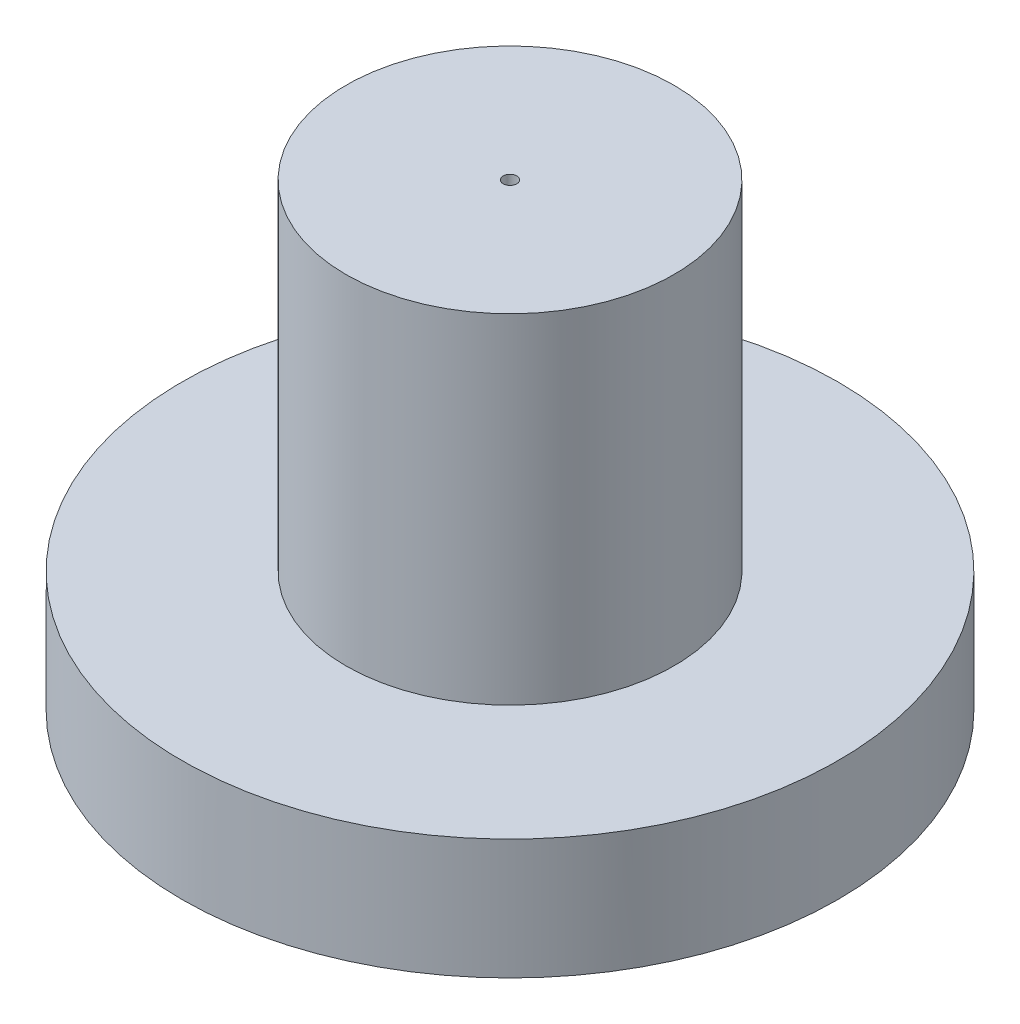
ISO-10303-21;
HEADER;
FILE_DESCRIPTION(('STEP AP214'),'2;1');
FILE_NAME('part.step','',(''),(''),'','','');
FILE_SCHEMA(('AUTOMOTIVE_DESIGN { 1 0 10303 214 1 1 1 1 }'));
ENDSEC;
DATA;
#1=APPLICATION_CONTEXT('core data for automotive mechanical design processes');
#2=APPLICATION_PROTOCOL_DEFINITION('international standard','automotive_design',2000,#1);
#3=PRODUCT_CONTEXT('',#1,'mechanical');
#4=PRODUCT('Part','Part','',(#3));
#5=PRODUCT_RELATED_PRODUCT_CATEGORY('part','',(#4));
#6=PRODUCT_DEFINITION_FORMATION('','',#4);
#7=PRODUCT_DEFINITION_CONTEXT('part definition',#1,'design');
#8=PRODUCT_DEFINITION('design','',#6,#7);
#9=PRODUCT_DEFINITION_SHAPE('','',#8);
#10=(LENGTH_UNIT() NAMED_UNIT(*) SI_UNIT(.MILLI.,.METRE.));
#11=(NAMED_UNIT(*) PLANE_ANGLE_UNIT() SI_UNIT($,.RADIAN.));
#12=(NAMED_UNIT(*) SI_UNIT($,.STERADIAN.) SOLID_ANGLE_UNIT());
#13=UNCERTAINTY_MEASURE_WITH_UNIT(LENGTH_MEASURE(1.E-05),#10,'distance_accuracy_value','');
#14=(GEOMETRIC_REPRESENTATION_CONTEXT(3) GLOBAL_UNCERTAINTY_ASSIGNED_CONTEXT((#13)) GLOBAL_UNIT_ASSIGNED_CONTEXT((#10,
#11,#12)) REPRESENTATION_CONTEXT('',''));
#15=CARTESIAN_POINT('',(0.,0.,0.));
#16=DIRECTION('',(0.,0.,1.));
#17=DIRECTION('',(1.,0.,0.));
#18=AXIS2_PLACEMENT_3D('',#15,#16,#17);
#19=CARTESIAN_POINT('',(0.,16.6728719726352,0.));
#20=DIRECTION('',(0.,1.,0.));
#21=DIRECTION('',(-1.,0.,0.));
#22=AXIS2_PLACEMENT_3D('',#19,#20,#21);
#23=SPHERICAL_SURFACE('',#22,20.8080401316239);
#24=CARTESIAN_POINT('',(0.,-1.68290461456677,0.));
#25=DIRECTION('',(0.,1.,0.));
#26=DIRECTION('',(0.,0.,1.));
#27=AXIS2_PLACEMENT_3D('',#24,#25,#26);
#28=CIRCLE('',#27,9.8);
#29=CARTESIAN_POINT('',(0.,-1.68290461456677,9.8));
#30=VERTEX_POINT('',#29);
#31=EDGE_CURVE('E11',#30,#30,#28,.T.);
#32=ORIENTED_EDGE('',*,*,#31,.F.);
#33=EDGE_LOOP('',(#32));
#34=FACE_BOUND('',#33,.T.);
#35=ADVANCED_FACE('F45',(#34),#23,.T.);
#36=CARTESIAN_POINT('',(0.,-29.3754521456294,0.));
#37=DIRECTION('',(0.,1.,0.));
#38=DIRECTION('',(1.,0.,0.));
#39=AXIS2_PLACEMENT_3D('',#36,#37,#38);
#40=SPHERICAL_SURFACE('',#39,29.3754521456294);
#41=ORIENTED_EDGE('',*,*,#31,.T.);
#42=EDGE_LOOP('',(#41));
#43=FACE_BOUND('',#42,.T.);
#44=ADVANCED_FACE('F52',(#43),#40,.T.);
#45=CLOSED_SHELL('',(#35,#44));
#46=MANIFOLD_SOLID_BREP('B2',#45);
#47=CARTESIAN_POINT('',(0.,4.56242759464748,0.));
#48=DIRECTION('',(0.,-1.,0.));
#49=DIRECTION('',(1.,0.,0.));
#50=AXIS2_PLACEMENT_3D('',#47,#48,#49);
#51=SPHERICAL_SURFACE('',#50,6.27592735682813);
#52=CARTESIAN_POINT('',(0.,-0.273610472632774,0.));
#53=DIRECTION('',(0.,-1.,0.));
#54=DIRECTION('',(0.,0.,-1.));
#55=AXIS2_PLACEMENT_3D('',#52,#53,#54);
#56=CIRCLE('',#55,3.99999999999998);
#57=CARTESIAN_POINT('',(0.,-0.273610472632774,-3.99999999999998));
#58=VERTEX_POINT('',#57);
#59=EDGE_CURVE('E44',#58,#58,#56,.T.);
#60=ORIENTED_EDGE('',*,*,#59,.T.);
#61=EDGE_LOOP('',(#60));
#62=FACE_BOUND('',#61,.T.);
#63=ADVANCED_FACE('F78',(#62),#51,.T.);
#64=CARTESIAN_POINT('',(0.,-29.3754521456294,0.));
#65=DIRECTION('',(0.,-1.,0.));
#66=DIRECTION('',(1.,0.,0.));
#67=AXIS2_PLACEMENT_3D('',#64,#65,#66);
#68=SPHERICAL_SURFACE('',#67,29.3754521456294);
#69=ORIENTED_EDGE('',*,*,#59,.F.);
#70=EDGE_LOOP('',(#69));
#71=FACE_BOUND('',#70,.T.);
#72=ADVANCED_FACE('F86',(#71),#68,.T.);
#73=CLOSED_SHELL('',(#63,#72));
#74=MANIFOLD_SOLID_BREP('B6',#73);
#75=CARTESIAN_POINT('',(0.,0.411792342612853,0.));
#76=DIRECTION('',(0.,-1.,0.));
#77=DIRECTION('',(1.,0.,0.));
#78=AXIS2_PLACEMENT_3D('',#75,#76,#77);
#79=SPHERICAL_SURFACE('',#78,1.56607891671429);
#80=CARTESIAN_POINT('',(0.,-0.0383222798745857,0.));
#81=DIRECTION('',(0.,-1.,0.));
#82=DIRECTION('',(0.,0.,-1.));
#83=AXIS2_PLACEMENT_3D('',#80,#81,#82);
#84=CIRCLE('',#83,1.50000000000003);
#85=CARTESIAN_POINT('',(0.,-0.0383222798745857,-1.50000000000003));
#86=VERTEX_POINT('',#85);
#87=EDGE_CURVE('E77',#86,#86,#84,.T.);
#88=ORIENTED_EDGE('',*,*,#87,.T.);
#89=EDGE_LOOP('',(#88));
#90=FACE_BOUND('',#89,.T.);
#91=ADVANCED_FACE('F111',(#90),#79,.T.);
#92=CARTESIAN_POINT('',(0.,-29.3754521456294,0.));
#93=DIRECTION('',(0.,-1.,0.));
#94=DIRECTION('',(1.,0.,0.));
#95=AXIS2_PLACEMENT_3D('',#92,#93,#94);
#96=SPHERICAL_SURFACE('',#95,29.3754521456294);
#97=ORIENTED_EDGE('',*,*,#87,.F.);
#98=EDGE_LOOP('',(#97));
#99=FACE_BOUND('',#98,.T.);
#100=ADVANCED_FACE('F119',(#99),#96,.T.);
#101=CLOSED_SHELL('',(#91,#100));
#102=MANIFOLD_SOLID_BREP('B39',#101);
#103=CARTESIAN_POINT('',(0.,-29.3754521456294,0.));
#104=DIRECTION('',(0.,-1.,0.));
#105=DIRECTION('',(1.,0.,0.));
#106=AXIS2_PLACEMENT_3D('',#103,#104,#105);
#107=SPHERICAL_SURFACE('',#106,29.3754521456294);
#108=CARTESIAN_POINT('',(0.,-0.00106383267617707,0.));
#109=DIRECTION('',(0.,-1.,0.));
#110=DIRECTION('',(0.,0.,-1.));
#111=AXIS2_PLACEMENT_3D('',#108,#109,#110);
#112=CIRCLE('',#111,0.25);
#113=CARTESIAN_POINT('',(0.250000000000037,-0.0010638326761736,0.));
#114=VERTEX_POINT('',#113);
#115=EDGE_CURVE('E159',#114,#114,#112,.F.);
#116=CARTESIAN_POINT('',(0.,-1.68290461456677,0.));
#117=DIRECTION('',(0.,-1.,0.));
#118=DIRECTION('',(0.,0.,-1.));
#119=AXIS2_PLACEMENT_3D('',#116,#117,#118);
#120=CIRCLE('',#119,9.8);
#121=CARTESIAN_POINT('',(9.79999999999999,-1.68290461456677,0.));
#122=VERTEX_POINT('',#121);
#123=EDGE_CURVE('E155',#122,#122,#120,.T.);
#124=CARTESIAN_POINT('',(0.250000000000037,-0.0010638326761736,0.));
#125=CARTESIAN_POINT('',(0.35147069301756,-0.00192741074692988,0.));
#126=CARTESIAN_POINT('',(0.452936910519536,-0.00331680817476606,0.));
#127=CARTESIAN_POINT('',(0.655849499255433,-0.00714700347790485,0.));
#128=CARTESIAN_POINT('',(0.757295870489355,-0.00958780135320747,0.));
#129=CARTESIAN_POINT('',(0.960157871452184,-0.0155205592845858,0.));
#130=CARTESIAN_POINT('',(1.06157350118109,-0.0190125193406616,0.));
#131=CARTESIAN_POINT('',(1.2643631277695,-0.0270472202224239,0.));
#132=CARTESIAN_POINT('',(1.36573712462901,-0.0315899610481104,0.));
#133=CARTESIAN_POINT('',(1.56843259843234,-0.0417257373167114,0.));
#134=CARTESIAN_POINT('',(1.66975407537618,-0.0473187727596258,0.));
#135=CARTESIAN_POINT('',(1.87233362798325,-0.0595545371421592,0.));
#136=CARTESIAN_POINT('',(1.97359170364649,-0.0661972660817782,0.));
#137=CARTESIAN_POINT('',(2.17603357912543,-0.0805317041878907,0.));
#138=CARTESIAN_POINT('',(2.27721737894113,-0.0882234133543842,0.));
#139=CARTESIAN_POINT('',(2.47949983613779,-0.104654985833709,0.));
#140=CARTESIAN_POINT('',(2.58059849351876,-0.113394849146539,0.));
#141=CARTESIAN_POINT('',(2.78269980840183,-0.131921791313752,0.));
#142=CARTESIAN_POINT('',(2.88370246590393,-0.141708870168134,0.));
#143=CARTESIAN_POINT('',(3.08560093389518,-0.162329192337235,0.));
#144=CARTESIAN_POINT('',(3.18649674438434,-0.173162435651954,0.));
#145=CARTESIAN_POINT('',(3.38817068269037,-0.195873923311165,0.));
#146=CARTESIAN_POINT('',(3.48894881050725,-0.207752167655656,0.));
#147=CARTESIAN_POINT('',(3.69037656044788,-0.232552381715632,0.));
#148=CARTESIAN_POINT('',(3.79102618257163,-0.245474351431117,0.));
#149=CARTESIAN_POINT('',(3.99218611190596,-0.27236062848411,0.));
#150=CARTESIAN_POINT('',(4.09269641911655,-0.286324935821617,0.));
#151=CARTESIAN_POINT('',(4.29356692436616,-0.315294388428257,0.));
#152=CARTESIAN_POINT('',(4.39392712240519,-0.33029953369739,0.));
#153=CARTESIAN_POINT('',(4.59448663117424,-0.361349050696583,0.));
#154=CARTESIAN_POINT('',(4.69468594190425,-0.377393422426644,0.));
#155=CARTESIAN_POINT('',(4.89491291519619,-0.410519669269744,0.));
#156=CARTESIAN_POINT('',(4.99494057775813,-0.427601544382785,0.));
#157=CARTESIAN_POINT('',(5.19481351228894,-0.462800963491692,0.));
#158=CARTESIAN_POINT('',(5.29465878425782,-0.480918507487559,0.));
#159=CARTESIAN_POINT('',(5.4941562147653,-0.518187318636791,0.));
#160=CARTESIAN_POINT('',(5.5938083733039,-0.537338585790156,0.));
#161=CARTESIAN_POINT('',(5.79290887485292,-0.576672786512823,0.));
#162=CARTESIAN_POINT('',(5.89235721786334,-0.596855720082125,0.));
#163=CARTESIAN_POINT('',(6.0910394081468,-0.63825108609976,0.));
#164=CARTESIAN_POINT('',(6.19027325541982,-0.659463518548092,0.));
#165=CARTESIAN_POINT('',(6.38851579705493,-0.702915604224343,0.));
#166=CARTESIAN_POINT('',(6.48752449141701,-0.725155257452261,0.));
#167=CARTESIAN_POINT('',(6.68530609423688,-0.770659396270271,0.));
#168=CARTESIAN_POINT('',(6.78407900269467,-0.793923881860363,0.));
#169=CARTESIAN_POINT('',(6.98137842603466,-0.841475186924111,0.));
#170=CARTESIAN_POINT('',(7.07990494091687,-0.865762006397767,0.));
#171=CARTESIAN_POINT('',(7.276700995896,-0.915355370956206,0.));
#172=CARTESIAN_POINT('',(7.37497053599292,-0.940661916040988,0.));
#173=CARTESIAN_POINT('',(7.57124208778848,-0.992292014039096,0.));
#174=CARTESIAN_POINT('',(7.66924409948712,-1.01861556695242,0.));
#175=CARTESIAN_POINT('',(7.86497006960786,-1.07227685359336,0.));
#176=CARTESIAN_POINT('',(7.96269402802995,-1.09961458732098,0.));
#177=CARTESIAN_POINT('',(8.15785339656719,-1.1553012996983,0.));
#178=CARTESIAN_POINT('',(8.25528880668234,-1.18365027834801,0.));
#179=CARTESIAN_POINT('',(8.44986061461429,-1.24135643592756,0.));
#180=CARTESIAN_POINT('',(8.54699701243111,-1.2707136148574,0.));
#181=CARTESIAN_POINT('',(8.7409603636988,-1.33043302063082,0.));
#182=CARTESIAN_POINT('',(8.83778731714968,-1.3607952474744,0.));
#183=CARTESIAN_POINT('',(9.0311213815541,-1.4225214867167,0.));
#184=CARTESIAN_POINT('',(9.12762849250763,-1.45388549911541,0.));
#185=CARTESIAN_POINT('',(9.32031250550958,-1.51761194719453,0.));
#186=CARTESIAN_POINT('',(9.41648940755799,-1.54997438287493,0.));
#187=CARTESIAN_POINT('',(9.60850268160377,-1.6156941793885,0.));
#188=CARTESIAN_POINT('',(9.70433905360113,-1.64905154022167,0.));
#189=CARTESIAN_POINT('',(9.79999999999999,-1.68290461456677,0.));
#190=B_SPLINE_CURVE_WITH_KNOTS('',3,(#124,#125,#126,#127,#128,#129,#130,#131,#132,#133,#134,
#135,#136,#137,#138,#139,#140,#141,#142,#143,#144,#145,#146,#147,#148,#149,#150,#151,#152,#153,
#154,#155,#156,#157,#158,#159,#160,#161,#162,#163,#164,#165,#166,#167,#168,#169,#170,#171,#172,
#173,#174,#175,#176,#177,#178,#179,#180,#181,#182,#183,#184,#185,#186,#187,#188,#189),
.UNSPECIFIED.,.F.,.F.,(4,2,2,2,2,2,2,2,2,2,2,2,2,2,2,2,2,2,2,2,2,2,2,2,2,2,2,2,2,2,2,2,4),(0.,
0.304421740379094,0.608843480758188,0.913265221137282,1.21768696151638,1.52210870189548,
1.82653044227457,2.13095218265367,2.43537392303276,2.73979566341185,3.04421740379095,
3.34863914417004,3.65306088454914,3.95748262492824,4.26190436530733,4.56632610568642,
4.87074784606552,5.17516958644461,5.47959132682371,5.7840130672028,6.0884348075819,
6.39285654796099,6.69727828834009,7.00170002871918,7.30612176909828,7.61054350947737,
7.91496524985646,8.21938699023556,8.52380873061466,8.82823047099375,9.13265221137285,
9.43707395175194,9.74149569213103),.UNSPECIFIED.);
#191=EDGE_CURVE('BSEAM136',#114,#122,#190,.T.);
#192=ORIENTED_EDGE('',*,*,#115,.T.);
#193=ORIENTED_EDGE('',*,*,#123,.T.);
#194=ORIENTED_EDGE('',*,*,#191,.T.);
#195=ORIENTED_EDGE('',*,*,#191,.F.);
#196=EDGE_LOOP('',(#192,#194,#193,#195));
#197=FACE_BOUND('',#196,.T.);
#198=ADVANCED_FACE('F136',(#197),#107,.F.);
#199=CARTESIAN_POINT('',(0.,15.7170953854332,0.));
#200=DIRECTION('',(0.,1.,0.));
#201=DIRECTION('',(0.,0.,1.));
#202=AXIS2_PLACEMENT_3D('',#199,#200,#201);
#203=PLANE('',#202);
#204=CARTESIAN_POINT('',(0.,15.7170953854332,0.));
#205=DIRECTION('',(0.,1.,0.));
#206=DIRECTION('',(0.,0.,1.));
#207=AXIS2_PLACEMENT_3D('',#204,#205,#206);
#208=CIRCLE('',#207,0.25);
#209=CARTESIAN_POINT('',(0.,15.7170953854332,0.25));
#210=VERTEX_POINT('',#209);
#211=EDGE_CURVE('E158',#210,#210,#208,.T.);
#212=ORIENTED_EDGE('',*,*,#211,.F.);
#213=EDGE_LOOP('',(#212));
#214=FACE_BOUND('',#213,.T.);
#215=CARTESIAN_POINT('',(0.,15.7170953854332,0.));
#216=DIRECTION('',(0.,-1.,0.));
#217=DIRECTION('',(0.,0.,-1.));
#218=AXIS2_PLACEMENT_3D('',#215,#216,#217);
#219=CIRCLE('',#218,6.);
#220=CARTESIAN_POINT('',(0.,15.7170953854332,-6.));
#221=VERTEX_POINT('',#220);
#222=EDGE_CURVE('E110',#221,#221,#219,.T.);
#223=ORIENTED_EDGE('',*,*,#222,.F.);
#224=EDGE_LOOP('',(#223));
#225=FACE_BOUND('',#224,.T.);
#226=ADVANCED_FACE('F167',(#214,#225),#203,.T.);
#227=CARTESIAN_POINT('',(0.,0.,0.));
#228=DIRECTION('',(0.,-1.,0.));
#229=DIRECTION('',(0.,0.,-1.));
#230=AXIS2_PLACEMENT_3D('',#227,#228,#229);
#231=CYLINDRICAL_SURFACE('',#230,6.);
#232=ORIENTED_EDGE('',*,*,#222,.T.);
#233=EDGE_LOOP('',(#232));
#234=FACE_BOUND('',#233,.T.);
#235=CARTESIAN_POINT('',(0.,3.31709538543323,0.));
#236=DIRECTION('',(0.,-1.,0.));
#237=DIRECTION('',(0.,0.,-1.));
#238=AXIS2_PLACEMENT_3D('',#235,#236,#237);
#239=CIRCLE('',#238,6.);
#240=CARTESIAN_POINT('',(0.,3.31709538543323,-6.));
#241=VERTEX_POINT('',#240);
#242=EDGE_CURVE('E142',#241,#241,#239,.T.);
#243=ORIENTED_EDGE('',*,*,#242,.F.);
#244=EDGE_LOOP('',(#243));
#245=FACE_BOUND('',#244,.T.);
#246=ADVANCED_FACE('F170',(#234,#245),#231,.T.);
#247=CARTESIAN_POINT('',(6.,3.31709538543323,0.));
#248=DIRECTION('',(0.,1.,0.));
#249=DIRECTION('',(0.,0.,1.));
#250=AXIS2_PLACEMENT_3D('',#247,#248,#249);
#251=PLANE('',#250);
#252=ORIENTED_EDGE('',*,*,#242,.T.);
#253=EDGE_LOOP('',(#252));
#254=FACE_BOUND('',#253,.T.);
#255=CARTESIAN_POINT('',(0.,3.31709538543323,0.));
#256=DIRECTION('',(0.,-1.,0.));
#257=DIRECTION('',(0.,0.,-1.));
#258=AXIS2_PLACEMENT_3D('',#255,#256,#257);
#259=CIRCLE('',#258,12.);
#260=CARTESIAN_POINT('',(0.,3.31709538543323,-12.));
#261=VERTEX_POINT('',#260);
#262=EDGE_CURVE('E146',#261,#261,#259,.T.);
#263=ORIENTED_EDGE('',*,*,#262,.F.);
#264=EDGE_LOOP('',(#263));
#265=FACE_BOUND('',#264,.T.);
#266=ADVANCED_FACE('F175',(#254,#265),#251,.T.);
#267=CARTESIAN_POINT('',(0.,0.,0.));
#268=DIRECTION('',(0.,-1.,0.));
#269=DIRECTION('',(0.,0.,-1.));
#270=AXIS2_PLACEMENT_3D('',#267,#268,#269);
#271=CYLINDRICAL_SURFACE('',#270,12.);
#272=ORIENTED_EDGE('',*,*,#262,.T.);
#273=EDGE_LOOP('',(#272));
#274=FACE_BOUND('',#273,.T.);
#275=CARTESIAN_POINT('',(0.,-1.08290461456677,0.));
#276=DIRECTION('',(0.,-1.,0.));
#277=DIRECTION('',(0.,0.,-1.));
#278=AXIS2_PLACEMENT_3D('',#275,#276,#277);
#279=CIRCLE('',#278,12.);
#280=CARTESIAN_POINT('',(0.,-1.08290461456677,-12.));
#281=VERTEX_POINT('',#280);
#282=EDGE_CURVE('E150',#281,#281,#279,.T.);
#283=ORIENTED_EDGE('',*,*,#282,.F.);
#284=EDGE_LOOP('',(#283));
#285=FACE_BOUND('',#284,.T.);
#286=ADVANCED_FACE('F181',(#274,#285),#271,.T.);
#287=CARTESIAN_POINT('',(0.,-1.68290461456677,0.));
#288=DIRECTION('',(0.,1.,0.));
#289=DIRECTION('',(0.,0.,1.));
#290=AXIS2_PLACEMENT_3D('',#287,#288,#289);
#291=CONICAL_SURFACE('',#290,9.8,1.30454427764397);
#292=ORIENTED_EDGE('',*,*,#282,.T.);
#293=EDGE_LOOP('',(#292));
#294=FACE_BOUND('',#293,.T.);
#295=ORIENTED_EDGE('',*,*,#123,.F.);
#296=EDGE_LOOP('',(#295));
#297=FACE_BOUND('',#296,.T.);
#298=ADVANCED_FACE('F184',(#294,#297),#291,.T.);
#299=CARTESIAN_POINT('',(0.,-1.68390461456677,0.));
#300=DIRECTION('',(0.,1.,0.));
#301=DIRECTION('',(0.,0.,1.));
#302=AXIS2_PLACEMENT_3D('',#299,#300,#301);
#303=CYLINDRICAL_SURFACE('',#302,0.25);
#304=ORIENTED_EDGE('',*,*,#115,.F.);
#305=EDGE_LOOP('',(#304));
#306=FACE_BOUND('',#305,.T.);
#307=ORIENTED_EDGE('',*,*,#211,.T.);
#308=EDGE_LOOP('',(#307));
#309=FACE_BOUND('',#308,.T.);
#310=ADVANCED_FACE('F165',(#306,#309),#303,.F.);
#311=CLOSED_SHELL('',(#198,#226,#246,#266,#286,#298,#310));
#312=MANIFOLD_SOLID_BREP('B72',#311);
#313=ADVANCED_BREP_SHAPE_REPRESENTATION('',(#18,#46,#74,#102,#312),#14);
#314=SHAPE_DEFINITION_REPRESENTATION(#9,#313);
ENDSEC;
END-ISO-10303-21;
